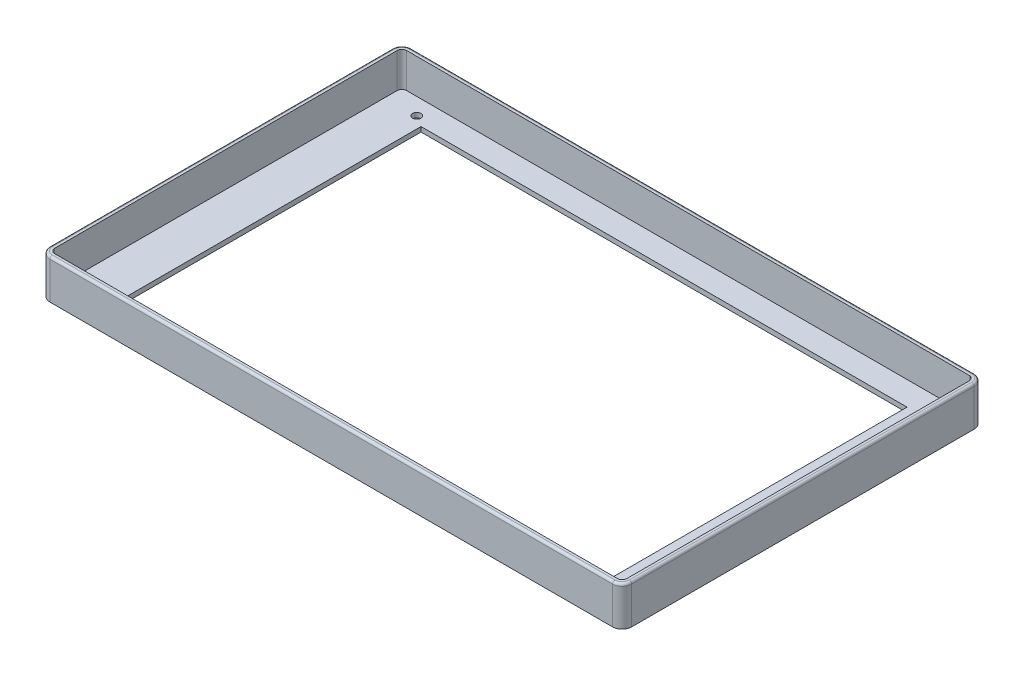
ISO-10303-21;
HEADER;
FILE_DESCRIPTION(('STEP AP214'),'2;1');
FILE_NAME('part.step','',(''),(''),'','','');
FILE_SCHEMA(('AUTOMOTIVE_DESIGN { 1 0 10303 214 1 1 1 1 }'));
ENDSEC;
DATA;
#1=APPLICATION_CONTEXT('core data for automotive mechanical design processes');
#2=APPLICATION_PROTOCOL_DEFINITION('international standard','automotive_design',2000,#1);
#3=PRODUCT_CONTEXT('',#1,'mechanical');
#4=PRODUCT('Part','Part','',(#3));
#5=PRODUCT_RELATED_PRODUCT_CATEGORY('part','',(#4));
#6=PRODUCT_DEFINITION_FORMATION('','',#4);
#7=PRODUCT_DEFINITION_CONTEXT('part definition',#1,'design');
#8=PRODUCT_DEFINITION('design','',#6,#7);
#9=PRODUCT_DEFINITION_SHAPE('','',#8);
#10=(LENGTH_UNIT() NAMED_UNIT(*) SI_UNIT(.MILLI.,.METRE.));
#11=(NAMED_UNIT(*) PLANE_ANGLE_UNIT() SI_UNIT($,.RADIAN.));
#12=(NAMED_UNIT(*) SI_UNIT($,.STERADIAN.) SOLID_ANGLE_UNIT());
#13=UNCERTAINTY_MEASURE_WITH_UNIT(LENGTH_MEASURE(1.E-05),#10,'distance_accuracy_value','');
#14=(GEOMETRIC_REPRESENTATION_CONTEXT(3) GLOBAL_UNCERTAINTY_ASSIGNED_CONTEXT((#13)) GLOBAL_UNIT_ASSIGNED_CONTEXT((#10,
#11,#12)) REPRESENTATION_CONTEXT('',''));
#15=CARTESIAN_POINT('',(0.,0.,0.));
#16=DIRECTION('',(0.,0.,1.));
#17=DIRECTION('',(1.,0.,0.));
#18=AXIS2_PLACEMENT_3D('',#15,#16,#17);
#19=CARTESIAN_POINT('',(0.,2.,0.));
#20=DIRECTION('',(0.,-1.,0.));
#21=DIRECTION('',(0.,0.,-1.));
#22=AXIS2_PLACEMENT_3D('',#19,#20,#21);
#23=PLANE('',#22);
#24=CARTESIAN_POINT('',(233.33,2.,-142.));
#25=DIRECTION('',(0.,1.,0.));
#26=DIRECTION('',(0.,0.,1.));
#27=AXIS2_PLACEMENT_3D('',#24,#25,#26);
#28=CIRCLE('',#27,1.75000000000001);
#29=CARTESIAN_POINT('',(233.33,2.,-140.25));
#30=VERTEX_POINT('',#29);
#31=EDGE_CURVE('E383',#30,#30,#28,.T.);
#32=ORIENTED_EDGE('',*,*,#31,.F.);
#33=EDGE_LOOP('',(#32));
#34=FACE_BOUND('',#33,.T.);
#35=CARTESIAN_POINT('',(15.23,2.,-9.));
#36=DIRECTION('',(0.,1.,0.));
#37=DIRECTION('',(0.,0.,1.));
#38=AXIS2_PLACEMENT_3D('',#35,#36,#37);
#39=CIRCLE('',#38,1.75);
#40=CARTESIAN_POINT('',(15.23,2.,-7.25));
#41=VERTEX_POINT('',#40);
#42=EDGE_CURVE('E393',#41,#41,#39,.T.);
#43=ORIENTED_EDGE('',*,*,#42,.F.);
#44=EDGE_LOOP('',(#43));
#45=FACE_BOUND('',#44,.T.);
#46=CARTESIAN_POINT('',(233.33,2.,-9.));
#47=DIRECTION('',(0.,1.,0.));
#48=DIRECTION('',(0.,0.,1.));
#49=AXIS2_PLACEMENT_3D('',#46,#47,#48);
#50=CIRCLE('',#49,1.75000000000001);
#51=CARTESIAN_POINT('',(233.33,2.,-7.24999999999999));
#52=VERTEX_POINT('',#51);
#53=EDGE_CURVE('E376',#52,#52,#50,.T.);
#54=ORIENTED_EDGE('',*,*,#53,.F.);
#55=EDGE_LOOP('',(#54));
#56=FACE_BOUND('',#55,.T.);
#57=CARTESIAN_POINT('',(15.23,2.,-142.));
#58=DIRECTION('',(0.,1.,0.));
#59=DIRECTION('',(0.,0.,1.));
#60=AXIS2_PLACEMENT_3D('',#57,#58,#59);
#61=CIRCLE('',#60,1.75);
#62=CARTESIAN_POINT('',(15.23,2.,-140.25));
#63=VERTEX_POINT('',#62);
#64=EDGE_CURVE('E390',#63,#63,#61,.T.);
#65=ORIENTED_EDGE('',*,*,#64,.F.);
#66=EDGE_LOOP('',(#65));
#67=FACE_BOUND('',#66,.T.);
#68=DIRECTION('',(0.,0.,1.));
#69=VECTOR('',#68,1.);
#70=CARTESIAN_POINT('',(2.,2.,-2.));
#71=LINE('',#70,#69);
#72=CARTESIAN_POINT('',(2.,2.,-147.));
#73=VERTEX_POINT('',#72);
#74=CARTESIAN_POINT('',(2.,2.,-4.));
#75=VERTEX_POINT('',#74);
#76=EDGE_CURVE('E398',#73,#75,#71,.T.);
#77=ORIENTED_EDGE('',*,*,#76,.T.);
#78=CARTESIAN_POINT('',(4.,2.,-4.));
#79=DIRECTION('',(0.,-1.,0.));
#80=DIRECTION('',(0.,0.,-1.));
#81=AXIS2_PLACEMENT_3D('',#78,#79,#80);
#82=CIRCLE('',#81,2.);
#83=CARTESIAN_POINT('',(4.,2.,-2.));
#84=VERTEX_POINT('',#83);
#85=EDGE_CURVE('E268',#75,#84,#82,.F.);
#86=ORIENTED_EDGE('',*,*,#85,.T.);
#87=DIRECTION('',(1.,0.,0.));
#88=VECTOR('',#87,1.);
#89=CARTESIAN_POINT('',(2.,2.,-2.));
#90=LINE('',#89,#88);
#91=CARTESIAN_POINT('',(239.,2.,-2.));
#92=VERTEX_POINT('',#91);
#93=EDGE_CURVE('E418',#84,#92,#90,.T.);
#94=ORIENTED_EDGE('',*,*,#93,.T.);
#95=CARTESIAN_POINT('',(239.,2.,-4.));
#96=DIRECTION('',(0.,-1.,0.));
#97=DIRECTION('',(0.,0.,-1.));
#98=AXIS2_PLACEMENT_3D('',#95,#96,#97);
#99=CIRCLE('',#98,2.);
#100=CARTESIAN_POINT('',(241.,2.,-4.));
#101=VERTEX_POINT('',#100);
#102=EDGE_CURVE('E266',#92,#101,#99,.F.);
#103=ORIENTED_EDGE('',*,*,#102,.T.);
#104=DIRECTION('',(0.,0.,-1.));
#105=VECTOR('',#104,1.);
#106=CARTESIAN_POINT('',(241.,2.,-2.));
#107=LINE('',#106,#105);
#108=CARTESIAN_POINT('',(241.,2.,-147.));
#109=VERTEX_POINT('',#108);
#110=EDGE_CURVE('E420',#101,#109,#107,.T.);
#111=ORIENTED_EDGE('',*,*,#110,.T.);
#112=CARTESIAN_POINT('',(239.,2.,-147.));
#113=DIRECTION('',(0.,-1.,0.));
#114=DIRECTION('',(0.,0.,-1.));
#115=AXIS2_PLACEMENT_3D('',#112,#113,#114);
#116=CIRCLE('',#115,2.);
#117=CARTESIAN_POINT('',(239.,2.,-149.));
#118=VERTEX_POINT('',#117);
#119=EDGE_CURVE('E262',#109,#118,#116,.F.);
#120=ORIENTED_EDGE('',*,*,#119,.T.);
#121=DIRECTION('',(-1.,0.,0.));
#122=VECTOR('',#121,1.);
#123=CARTESIAN_POINT('',(2.,2.,-149.));
#124=LINE('',#123,#122);
#125=CARTESIAN_POINT('',(4.,2.,-149.));
#126=VERTEX_POINT('',#125);
#127=EDGE_CURVE('E408',#118,#126,#124,.T.);
#128=ORIENTED_EDGE('',*,*,#127,.T.);
#129=CARTESIAN_POINT('',(4.,2.,-147.));
#130=DIRECTION('',(0.,-1.,0.));
#131=DIRECTION('',(0.,0.,-1.));
#132=AXIS2_PLACEMENT_3D('',#129,#130,#131);
#133=CIRCLE('',#132,2.);
#134=EDGE_CURVE('E265',#126,#73,#133,.F.);
#135=ORIENTED_EDGE('',*,*,#134,.T.);
#136=EDGE_LOOP('',(#77,#86,#94,#103,#111,#120,#128,#135));
#137=FACE_BOUND('',#136,.T.);
#138=DIRECTION('',(0.,0.,1.));
#139=VECTOR('',#138,1.);
#140=CARTESIAN_POINT('',(20.,2.,-14.));
#141=LINE('',#140,#139);
#142=CARTESIAN_POINT('',(20.,2.,-139.));
#143=VERTEX_POINT('',#142);
#144=CARTESIAN_POINT('',(20.,2.,-14.));
#145=VERTEX_POINT('',#144);
#146=EDGE_CURVE('E201',#143,#145,#141,.T.);
#147=ORIENTED_EDGE('',*,*,#146,.F.);
#148=DIRECTION('',(-1.,0.,0.));
#149=VECTOR('',#148,1.);
#150=CARTESIAN_POINT('',(20.,2.,-139.));
#151=LINE('',#150,#149);
#152=CARTESIAN_POINT('',(223.,2.,-139.));
#153=VERTEX_POINT('',#152);
#154=EDGE_CURVE('E227',#153,#143,#151,.T.);
#155=ORIENTED_EDGE('',*,*,#154,.F.);
#156=DIRECTION('',(0.,0.,-1.));
#157=VECTOR('',#156,1.);
#158=CARTESIAN_POINT('',(223.,2.,-14.));
#159=LINE('',#158,#157);
#160=CARTESIAN_POINT('',(223.,2.,-14.));
#161=VERTEX_POINT('',#160);
#162=EDGE_CURVE('E228',#161,#153,#159,.T.);
#163=ORIENTED_EDGE('',*,*,#162,.F.);
#164=DIRECTION('',(1.,0.,0.));
#165=VECTOR('',#164,1.);
#166=CARTESIAN_POINT('',(20.,2.,-14.));
#167=LINE('',#166,#165);
#168=EDGE_CURVE('E213',#145,#161,#167,.T.);
#169=ORIENTED_EDGE('',*,*,#168,.F.);
#170=EDGE_LOOP('',(#147,#155,#163,#169));
#171=FACE_BOUND('',#170,.T.);
#172=ADVANCED_FACE('F39',(#34,#45,#56,#67,#137,#171),#23,.F.);
#173=CARTESIAN_POINT('',(0.,0.,0.));
#174=DIRECTION('',(0.,-1.,0.));
#175=DIRECTION('',(0.,0.,-1.));
#176=AXIS2_PLACEMENT_3D('',#173,#174,#175);
#177=PLANE('',#176);
#178=CARTESIAN_POINT('',(233.33,0.,-142.));
#179=DIRECTION('',(0.,1.,0.));
#180=DIRECTION('',(0.,0.,1.));
#181=AXIS2_PLACEMENT_3D('',#178,#179,#180);
#182=CIRCLE('',#181,1.75000000000001);
#183=CARTESIAN_POINT('',(233.33,0.,-140.25));
#184=VERTEX_POINT('',#183);
#185=EDGE_CURVE('E389',#184,#184,#182,.T.);
#186=ORIENTED_EDGE('',*,*,#185,.T.);
#187=EDGE_LOOP('',(#186));
#188=FACE_BOUND('',#187,.T.);
#189=CARTESIAN_POINT('',(15.23,0.,-9.));
#190=DIRECTION('',(0.,1.,0.));
#191=DIRECTION('',(0.,0.,1.));
#192=AXIS2_PLACEMENT_3D('',#189,#190,#191);
#193=CIRCLE('',#192,1.75);
#194=CARTESIAN_POINT('',(15.23,0.,-7.25));
#195=VERTEX_POINT('',#194);
#196=EDGE_CURVE('E381',#195,#195,#193,.T.);
#197=ORIENTED_EDGE('',*,*,#196,.T.);
#198=EDGE_LOOP('',(#197));
#199=FACE_BOUND('',#198,.T.);
#200=CARTESIAN_POINT('',(233.33,0.,-9.));
#201=DIRECTION('',(0.,1.,0.));
#202=DIRECTION('',(0.,0.,1.));
#203=AXIS2_PLACEMENT_3D('',#200,#201,#202);
#204=CIRCLE('',#203,1.75000000000001);
#205=CARTESIAN_POINT('',(233.33,0.,-7.24999999999999));
#206=VERTEX_POINT('',#205);
#207=EDGE_CURVE('E367',#206,#206,#204,.T.);
#208=ORIENTED_EDGE('',*,*,#207,.T.);
#209=EDGE_LOOP('',(#208));
#210=FACE_BOUND('',#209,.T.);
#211=CARTESIAN_POINT('',(15.23,0.,-142.));
#212=DIRECTION('',(0.,1.,0.));
#213=DIRECTION('',(0.,0.,1.));
#214=AXIS2_PLACEMENT_3D('',#211,#212,#213);
#215=CIRCLE('',#214,1.75);
#216=CARTESIAN_POINT('',(15.23,0.,-140.25));
#217=VERTEX_POINT('',#216);
#218=EDGE_CURVE('E399',#217,#217,#215,.T.);
#219=ORIENTED_EDGE('',*,*,#218,.T.);
#220=EDGE_LOOP('',(#219));
#221=FACE_BOUND('',#220,.T.);
#222=DIRECTION('',(0.,0.,1.));
#223=VECTOR('',#222,1.);
#224=CARTESIAN_POINT('',(0.,0.,0.));
#225=LINE('',#224,#223);
#226=CARTESIAN_POINT('',(0.,0.,-147.));
#227=VERTEX_POINT('',#226);
#228=CARTESIAN_POINT('',(0.,0.,-4.));
#229=VERTEX_POINT('',#228);
#230=EDGE_CURVE('E222',#227,#229,#225,.T.);
#231=ORIENTED_EDGE('',*,*,#230,.F.);
#232=CARTESIAN_POINT('',(4.,0.,-147.));
#233=DIRECTION('',(0.,-1.,0.));
#234=DIRECTION('',(0.,0.,-1.));
#235=AXIS2_PLACEMENT_3D('',#232,#233,#234);
#236=CIRCLE('',#235,4.);
#237=CARTESIAN_POINT('',(4.,0.,-151.));
#238=VERTEX_POINT('',#237);
#239=EDGE_CURVE('E303',#227,#238,#236,.T.);
#240=ORIENTED_EDGE('',*,*,#239,.T.);
#241=DIRECTION('',(-1.,0.,0.));
#242=VECTOR('',#241,1.);
#243=CARTESIAN_POINT('',(0.,0.,-151.));
#244=LINE('',#243,#242);
#245=CARTESIAN_POINT('',(239.,0.,-151.));
#246=VERTEX_POINT('',#245);
#247=EDGE_CURVE('E255',#246,#238,#244,.T.);
#248=ORIENTED_EDGE('',*,*,#247,.F.);
#249=CARTESIAN_POINT('',(239.,0.,-147.));
#250=DIRECTION('',(0.,-1.,0.));
#251=DIRECTION('',(0.,0.,-1.));
#252=AXIS2_PLACEMENT_3D('',#249,#250,#251);
#253=CIRCLE('',#252,4.);
#254=CARTESIAN_POINT('',(243.,0.,-147.));
#255=VERTEX_POINT('',#254);
#256=EDGE_CURVE('E301',#246,#255,#253,.T.);
#257=ORIENTED_EDGE('',*,*,#256,.T.);
#258=DIRECTION('',(0.,0.,-1.));
#259=VECTOR('',#258,1.);
#260=CARTESIAN_POINT('',(243.,0.,0.));
#261=LINE('',#260,#259);
#262=CARTESIAN_POINT('',(243.,0.,-4.));
#263=VERTEX_POINT('',#262);
#264=EDGE_CURVE('E253',#263,#255,#261,.T.);
#265=ORIENTED_EDGE('',*,*,#264,.F.);
#266=CARTESIAN_POINT('',(239.,0.,-4.));
#267=DIRECTION('',(0.,-1.,0.));
#268=DIRECTION('',(0.,0.,-1.));
#269=AXIS2_PLACEMENT_3D('',#266,#267,#268);
#270=CIRCLE('',#269,4.);
#271=CARTESIAN_POINT('',(239.,0.,0.));
#272=VERTEX_POINT('',#271);
#273=EDGE_CURVE('E296',#263,#272,#270,.T.);
#274=ORIENTED_EDGE('',*,*,#273,.T.);
#275=DIRECTION('',(1.,0.,0.));
#276=VECTOR('',#275,1.);
#277=CARTESIAN_POINT('',(0.,0.,0.));
#278=LINE('',#277,#276);
#279=CARTESIAN_POINT('',(4.,0.,0.));
#280=VERTEX_POINT('',#279);
#281=EDGE_CURVE('E250',#280,#272,#278,.T.);
#282=ORIENTED_EDGE('',*,*,#281,.F.);
#283=CARTESIAN_POINT('',(4.,0.,-4.));
#284=DIRECTION('',(0.,-1.,0.));
#285=DIRECTION('',(0.,0.,-1.));
#286=AXIS2_PLACEMENT_3D('',#283,#284,#285);
#287=CIRCLE('',#286,4.);
#288=EDGE_CURVE('E297',#280,#229,#287,.T.);
#289=ORIENTED_EDGE('',*,*,#288,.T.);
#290=EDGE_LOOP('',(#231,#240,#248,#257,#265,#274,#282,#289));
#291=FACE_BOUND('',#290,.T.);
#292=DIRECTION('',(-1.,0.,0.));
#293=VECTOR('',#292,1.);
#294=CARTESIAN_POINT('',(20.,0.,-139.));
#295=LINE('',#294,#293);
#296=CARTESIAN_POINT('',(223.,0.,-139.));
#297=VERTEX_POINT('',#296);
#298=CARTESIAN_POINT('',(20.,0.,-139.));
#299=VERTEX_POINT('',#298);
#300=EDGE_CURVE('E212',#297,#299,#295,.T.);
#301=ORIENTED_EDGE('',*,*,#300,.T.);
#302=DIRECTION('',(0.,0.,1.));
#303=VECTOR('',#302,1.);
#304=CARTESIAN_POINT('',(20.,0.,-14.));
#305=LINE('',#304,#303);
#306=CARTESIAN_POINT('',(20.,0.,-14.));
#307=VERTEX_POINT('',#306);
#308=EDGE_CURVE('E235',#299,#307,#305,.T.);
#309=ORIENTED_EDGE('',*,*,#308,.T.);
#310=DIRECTION('',(1.,0.,0.));
#311=VECTOR('',#310,1.);
#312=CARTESIAN_POINT('',(20.,0.,-14.));
#313=LINE('',#312,#311);
#314=CARTESIAN_POINT('',(223.,0.,-14.));
#315=VERTEX_POINT('',#314);
#316=EDGE_CURVE('E219',#307,#315,#313,.T.);
#317=ORIENTED_EDGE('',*,*,#316,.T.);
#318=DIRECTION('',(0.,0.,-1.));
#319=VECTOR('',#318,1.);
#320=CARTESIAN_POINT('',(223.,0.,-14.));
#321=LINE('',#320,#319);
#322=EDGE_CURVE('E240',#315,#297,#321,.T.);
#323=ORIENTED_EDGE('',*,*,#322,.T.);
#324=EDGE_LOOP('',(#301,#309,#317,#323));
#325=FACE_BOUND('',#324,.T.);
#326=ADVANCED_FACE('F475',(#188,#199,#210,#221,#291,#325),#177,.T.);
#327=CARTESIAN_POINT('',(0.,2.,0.));
#328=DIRECTION('',(1.,0.,0.));
#329=DIRECTION('',(0.,0.,-1.));
#330=AXIS2_PLACEMENT_3D('',#327,#328,#329);
#331=PLANE('',#330);
#332=DIRECTION('',(0.,-1.,0.));
#333=VECTOR('',#332,1.);
#334=CARTESIAN_POINT('',(0.,2.,-4.));
#335=LINE('',#334,#333);
#336=CARTESIAN_POINT('',(0.,15.5,-4.));
#337=VERTEX_POINT('',#336);
#338=EDGE_CURVE('E291',#229,#337,#335,.F.);
#339=ORIENTED_EDGE('',*,*,#338,.T.);
#340=DIRECTION('',(0.,0.,1.));
#341=VECTOR('',#340,1.);
#342=CARTESIAN_POINT('',(0.,15.5,0.));
#343=LINE('',#342,#341);
#344=CARTESIAN_POINT('',(0.,15.5,-147.));
#345=VERTEX_POINT('',#344);
#346=EDGE_CURVE('E340',#337,#345,#343,.F.);
#347=ORIENTED_EDGE('',*,*,#346,.T.);
#348=DIRECTION('',(0.,-1.,0.));
#349=VECTOR('',#348,1.);
#350=CARTESIAN_POINT('',(0.,2.,-147.));
#351=LINE('',#350,#349);
#352=EDGE_CURVE('E298',#345,#227,#351,.T.);
#353=ORIENTED_EDGE('',*,*,#352,.T.);
#354=ORIENTED_EDGE('',*,*,#230,.T.);
#355=EDGE_LOOP('',(#339,#347,#353,#354));
#356=FACE_BOUND('',#355,.T.);
#357=ADVANCED_FACE('F481',(#356),#331,.F.);
#358=CARTESIAN_POINT('',(0.,2.,0.));
#359=DIRECTION('',(0.,0.,-1.));
#360=DIRECTION('',(-1.,0.,0.));
#361=AXIS2_PLACEMENT_3D('',#358,#359,#360);
#362=PLANE('',#361);
#363=DIRECTION('',(0.,-1.,0.));
#364=VECTOR('',#363,1.);
#365=CARTESIAN_POINT('',(239.,2.,0.));
#366=LINE('',#365,#364);
#367=CARTESIAN_POINT('',(239.,15.5,0.));
#368=VERTEX_POINT('',#367);
#369=EDGE_CURVE('E320',#272,#368,#366,.F.);
#370=ORIENTED_EDGE('',*,*,#369,.T.);
#371=DIRECTION('',(1.,0.,0.));
#372=VECTOR('',#371,1.);
#373=CARTESIAN_POINT('',(0.,15.5,0.));
#374=LINE('',#373,#372);
#375=CARTESIAN_POINT('',(4.,15.5,0.));
#376=VERTEX_POINT('',#375);
#377=EDGE_CURVE('E11',#368,#376,#374,.F.);
#378=ORIENTED_EDGE('',*,*,#377,.T.);
#379=DIRECTION('',(0.,-1.,0.));
#380=VECTOR('',#379,1.);
#381=CARTESIAN_POINT('',(4.,2.,0.));
#382=LINE('',#381,#380);
#383=EDGE_CURVE('E312',#376,#280,#382,.T.);
#384=ORIENTED_EDGE('',*,*,#383,.T.);
#385=ORIENTED_EDGE('',*,*,#281,.T.);
#386=EDGE_LOOP('',(#370,#378,#384,#385));
#387=FACE_BOUND('',#386,.T.);
#388=ADVANCED_FACE('F497',(#387),#362,.F.);
#389=CARTESIAN_POINT('',(243.,2.,0.));
#390=DIRECTION('',(-1.,0.,0.));
#391=DIRECTION('',(0.,0.,1.));
#392=AXIS2_PLACEMENT_3D('',#389,#390,#391);
#393=PLANE('',#392);
#394=DIRECTION('',(0.,-1.,0.));
#395=VECTOR('',#394,1.);
#396=CARTESIAN_POINT('',(243.,2.,-147.));
#397=LINE('',#396,#395);
#398=CARTESIAN_POINT('',(243.,15.5,-147.));
#399=VERTEX_POINT('',#398);
#400=EDGE_CURVE('E311',#255,#399,#397,.F.);
#401=ORIENTED_EDGE('',*,*,#400,.T.);
#402=DIRECTION('',(0.,0.,-1.));
#403=VECTOR('',#402,1.);
#404=CARTESIAN_POINT('',(243.,15.5,0.));
#405=LINE('',#404,#403);
#406=CARTESIAN_POINT('',(243.,15.5,-4.));
#407=VERTEX_POINT('',#406);
#408=EDGE_CURVE('E62',#399,#407,#405,.F.);
#409=ORIENTED_EDGE('',*,*,#408,.T.);
#410=DIRECTION('',(0.,-1.,0.));
#411=VECTOR('',#410,1.);
#412=CARTESIAN_POINT('',(243.,2.,-4.));
#413=LINE('',#412,#411);
#414=EDGE_CURVE('E313',#407,#263,#413,.T.);
#415=ORIENTED_EDGE('',*,*,#414,.T.);
#416=ORIENTED_EDGE('',*,*,#264,.T.);
#417=EDGE_LOOP('',(#401,#409,#415,#416));
#418=FACE_BOUND('',#417,.T.);
#419=ADVANCED_FACE('F495',(#418),#393,.F.);
#420=CARTESIAN_POINT('',(0.,2.,-151.));
#421=DIRECTION('',(0.,0.,1.));
#422=DIRECTION('',(1.,0.,0.));
#423=AXIS2_PLACEMENT_3D('',#420,#421,#422);
#424=PLANE('',#423);
#425=DIRECTION('',(0.,-1.,0.));
#426=VECTOR('',#425,1.);
#427=CARTESIAN_POINT('',(4.,2.,-151.));
#428=LINE('',#427,#426);
#429=CARTESIAN_POINT('',(4.,15.5,-151.));
#430=VERTEX_POINT('',#429);
#431=EDGE_CURVE('E306',#238,#430,#428,.F.);
#432=ORIENTED_EDGE('',*,*,#431,.T.);
#433=DIRECTION('',(-1.,0.,0.));
#434=VECTOR('',#433,1.);
#435=CARTESIAN_POINT('',(0.,15.5,-151.));
#436=LINE('',#435,#434);
#437=CARTESIAN_POINT('',(239.,15.5,-151.));
#438=VERTEX_POINT('',#437);
#439=EDGE_CURVE('E345',#430,#438,#436,.F.);
#440=ORIENTED_EDGE('',*,*,#439,.T.);
#441=DIRECTION('',(0.,-1.,0.));
#442=VECTOR('',#441,1.);
#443=CARTESIAN_POINT('',(239.,2.,-151.));
#444=LINE('',#443,#442);
#445=EDGE_CURVE('E308',#438,#246,#444,.T.);
#446=ORIENTED_EDGE('',*,*,#445,.T.);
#447=ORIENTED_EDGE('',*,*,#247,.T.);
#448=EDGE_LOOP('',(#432,#440,#446,#447));
#449=FACE_BOUND('',#448,.T.);
#450=ADVANCED_FACE('F487',(#449),#424,.F.);
#451=CARTESIAN_POINT('',(20.,2.,-14.));
#452=DIRECTION('',(1.,0.,0.));
#453=DIRECTION('',(0.,0.,-1.));
#454=AXIS2_PLACEMENT_3D('',#451,#452,#453);
#455=PLANE('',#454);
#456=ORIENTED_EDGE('',*,*,#308,.F.);
#457=DIRECTION('',(0.,-1.,0.));
#458=VECTOR('',#457,1.);
#459=CARTESIAN_POINT('',(20.,2.,-139.));
#460=LINE('',#459,#458);
#461=EDGE_CURVE('E207',#143,#299,#460,.T.);
#462=ORIENTED_EDGE('',*,*,#461,.F.);
#463=ORIENTED_EDGE('',*,*,#146,.T.);
#464=DIRECTION('',(0.,-1.,0.));
#465=VECTOR('',#464,1.);
#466=CARTESIAN_POINT('',(20.,2.,-14.));
#467=LINE('',#466,#465);
#468=EDGE_CURVE('E206',#145,#307,#467,.T.);
#469=ORIENTED_EDGE('',*,*,#468,.T.);
#470=EDGE_LOOP('',(#456,#462,#463,#469));
#471=FACE_BOUND('',#470,.T.);
#472=ADVANCED_FACE('F202',(#471),#455,.T.);
#473=CARTESIAN_POINT('',(20.,2.,-14.));
#474=DIRECTION('',(0.,0.,-1.));
#475=DIRECTION('',(-1.,0.,0.));
#476=AXIS2_PLACEMENT_3D('',#473,#474,#475);
#477=PLANE('',#476);
#478=ORIENTED_EDGE('',*,*,#316,.F.);
#479=ORIENTED_EDGE('',*,*,#468,.F.);
#480=ORIENTED_EDGE('',*,*,#168,.T.);
#481=DIRECTION('',(0.,-1.,0.));
#482=VECTOR('',#481,1.);
#483=CARTESIAN_POINT('',(223.,2.,-14.));
#484=LINE('',#483,#482);
#485=EDGE_CURVE('E225',#161,#315,#484,.T.);
#486=ORIENTED_EDGE('',*,*,#485,.T.);
#487=EDGE_LOOP('',(#478,#479,#480,#486));
#488=FACE_BOUND('',#487,.T.);
#489=ADVANCED_FACE('F220',(#488),#477,.T.);
#490=CARTESIAN_POINT('',(223.,2.,-14.));
#491=DIRECTION('',(-1.,0.,0.));
#492=DIRECTION('',(0.,0.,1.));
#493=AXIS2_PLACEMENT_3D('',#490,#491,#492);
#494=PLANE('',#493);
#495=ORIENTED_EDGE('',*,*,#322,.F.);
#496=ORIENTED_EDGE('',*,*,#485,.F.);
#497=ORIENTED_EDGE('',*,*,#162,.T.);
#498=DIRECTION('',(0.,-1.,0.));
#499=VECTOR('',#498,1.);
#500=CARTESIAN_POINT('',(223.,2.,-139.));
#501=LINE('',#500,#499);
#502=EDGE_CURVE('E242',#153,#297,#501,.T.);
#503=ORIENTED_EDGE('',*,*,#502,.T.);
#504=EDGE_LOOP('',(#495,#496,#497,#503));
#505=FACE_BOUND('',#504,.T.);
#506=ADVANCED_FACE('F672',(#505),#494,.T.);
#507=CARTESIAN_POINT('',(20.,2.,-139.));
#508=DIRECTION('',(0.,0.,1.));
#509=DIRECTION('',(1.,0.,0.));
#510=AXIS2_PLACEMENT_3D('',#507,#508,#509);
#511=PLANE('',#510);
#512=ORIENTED_EDGE('',*,*,#300,.F.);
#513=ORIENTED_EDGE('',*,*,#502,.F.);
#514=ORIENTED_EDGE('',*,*,#154,.T.);
#515=ORIENTED_EDGE('',*,*,#461,.T.);
#516=EDGE_LOOP('',(#512,#513,#514,#515));
#517=FACE_BOUND('',#516,.T.);
#518=ADVANCED_FACE('F670',(#517),#511,.T.);
#519=CARTESIAN_POINT('',(0.,16.5,0.));
#520=DIRECTION('',(0.,-1.,0.));
#521=DIRECTION('',(0.,0.,-1.));
#522=AXIS2_PLACEMENT_3D('',#519,#520,#521);
#523=PLANE('',#522);
#524=DIRECTION('',(0.,0.,1.));
#525=VECTOR('',#524,1.);
#526=CARTESIAN_POINT('',(1.,16.5,0.));
#527=LINE('',#526,#525);
#528=CARTESIAN_POINT('',(1.,16.5,-147.));
#529=VERTEX_POINT('',#528);
#530=CARTESIAN_POINT('',(1.,16.5,-4.));
#531=VERTEX_POINT('',#530);
#532=EDGE_CURVE('E332',#529,#531,#527,.T.);
#533=ORIENTED_EDGE('',*,*,#532,.T.);
#534=CARTESIAN_POINT('',(4.,16.5,-4.));
#535=DIRECTION('',(0.,-1.,0.));
#536=DIRECTION('',(0.,0.,-1.));
#537=AXIS2_PLACEMENT_3D('',#534,#535,#536);
#538=CIRCLE('',#537,3.);
#539=CARTESIAN_POINT('',(4.,16.5,-1.));
#540=VERTEX_POINT('',#539);
#541=EDGE_CURVE('E334',#531,#540,#538,.F.);
#542=ORIENTED_EDGE('',*,*,#541,.T.);
#543=DIRECTION('',(1.,0.,0.));
#544=VECTOR('',#543,1.);
#545=CARTESIAN_POINT('',(0.,16.5,-1.));
#546=LINE('',#545,#544);
#547=CARTESIAN_POINT('',(239.,16.5,-1.));
#548=VERTEX_POINT('',#547);
#549=EDGE_CURVE('E317',#540,#548,#546,.T.);
#550=ORIENTED_EDGE('',*,*,#549,.T.);
#551=CARTESIAN_POINT('',(239.,16.5,-4.));
#552=DIRECTION('',(0.,-1.,0.));
#553=DIRECTION('',(0.,0.,-1.));
#554=AXIS2_PLACEMENT_3D('',#551,#552,#553);
#555=CIRCLE('',#554,3.);
#556=CARTESIAN_POINT('',(242.,16.5,-4.));
#557=VERTEX_POINT('',#556);
#558=EDGE_CURVE('E321',#548,#557,#555,.F.);
#559=ORIENTED_EDGE('',*,*,#558,.T.);
#560=DIRECTION('',(0.,0.,-1.));
#561=VECTOR('',#560,1.);
#562=CARTESIAN_POINT('',(242.,16.5,0.));
#563=LINE('',#562,#561);
#564=CARTESIAN_POINT('',(242.,16.5,-147.));
#565=VERTEX_POINT('',#564);
#566=EDGE_CURVE('E323',#557,#565,#563,.T.);
#567=ORIENTED_EDGE('',*,*,#566,.T.);
#568=CARTESIAN_POINT('',(239.,16.5,-147.));
#569=DIRECTION('',(0.,-1.,0.));
#570=DIRECTION('',(0.,0.,-1.));
#571=AXIS2_PLACEMENT_3D('',#568,#569,#570);
#572=CIRCLE('',#571,3.);
#573=CARTESIAN_POINT('',(239.,16.5,-150.));
#574=VERTEX_POINT('',#573);
#575=EDGE_CURVE('E324',#565,#574,#572,.F.);
#576=ORIENTED_EDGE('',*,*,#575,.T.);
#577=DIRECTION('',(-1.,0.,0.));
#578=VECTOR('',#577,1.);
#579=CARTESIAN_POINT('',(0.,16.5,-150.));
#580=LINE('',#579,#578);
#581=CARTESIAN_POINT('',(4.,16.5,-150.));
#582=VERTEX_POINT('',#581);
#583=EDGE_CURVE('E330',#574,#582,#580,.T.);
#584=ORIENTED_EDGE('',*,*,#583,.T.);
#585=CARTESIAN_POINT('',(4.,16.5,-147.));
#586=DIRECTION('',(0.,-1.,0.));
#587=DIRECTION('',(0.,0.,-1.));
#588=AXIS2_PLACEMENT_3D('',#585,#586,#587);
#589=CIRCLE('',#588,3.);
#590=EDGE_CURVE('E328',#582,#529,#589,.F.);
#591=ORIENTED_EDGE('',*,*,#590,.T.);
#592=EDGE_LOOP('',(#533,#542,#550,#559,#567,#576,#584,#591));
#593=FACE_BOUND('',#592,.T.);
#594=DIRECTION('',(0.,0.,1.));
#595=VECTOR('',#594,1.);
#596=CARTESIAN_POINT('',(2.,16.5,-2.));
#597=LINE('',#596,#595);
#598=CARTESIAN_POINT('',(2.,16.5,-147.));
#599=VERTEX_POINT('',#598);
#600=CARTESIAN_POINT('',(2.,16.5,-4.));
#601=VERTEX_POINT('',#600);
#602=EDGE_CURVE('E405',#599,#601,#597,.T.);
#603=ORIENTED_EDGE('',*,*,#602,.F.);
#604=CARTESIAN_POINT('',(4.,16.5,-147.));
#605=DIRECTION('',(0.,-1.,0.));
#606=DIRECTION('',(0.,0.,-1.));
#607=AXIS2_PLACEMENT_3D('',#604,#605,#606);
#608=CIRCLE('',#607,2.);
#609=CARTESIAN_POINT('',(4.,16.5,-149.));
#610=VERTEX_POINT('',#609);
#611=EDGE_CURVE('E292',#599,#610,#608,.T.);
#612=ORIENTED_EDGE('',*,*,#611,.T.);
#613=DIRECTION('',(-1.,0.,0.));
#614=VECTOR('',#613,1.);
#615=CARTESIAN_POINT('',(2.,16.5,-149.));
#616=LINE('',#615,#614);
#617=CARTESIAN_POINT('',(239.,16.5,-149.));
#618=VERTEX_POINT('',#617);
#619=EDGE_CURVE('E232',#618,#610,#616,.T.);
#620=ORIENTED_EDGE('',*,*,#619,.F.);
#621=CARTESIAN_POINT('',(239.,16.5,-147.));
#622=DIRECTION('',(0.,-1.,0.));
#623=DIRECTION('',(0.,0.,-1.));
#624=AXIS2_PLACEMENT_3D('',#621,#622,#623);
#625=CIRCLE('',#624,2.);
#626=CARTESIAN_POINT('',(241.,16.5,-147.));
#627=VERTEX_POINT('',#626);
#628=EDGE_CURVE('E288',#618,#627,#625,.T.);
#629=ORIENTED_EDGE('',*,*,#628,.T.);
#630=DIRECTION('',(0.,0.,-1.));
#631=VECTOR('',#630,1.);
#632=CARTESIAN_POINT('',(241.,16.5,-2.));
#633=LINE('',#632,#631);
#634=CARTESIAN_POINT('',(241.,16.5,-4.));
#635=VERTEX_POINT('',#634);
#636=EDGE_CURVE('E410',#635,#627,#633,.T.);
#637=ORIENTED_EDGE('',*,*,#636,.F.);
#638=CARTESIAN_POINT('',(239.,16.5,-4.));
#639=DIRECTION('',(0.,-1.,0.));
#640=DIRECTION('',(0.,0.,-1.));
#641=AXIS2_PLACEMENT_3D('',#638,#639,#640);
#642=CIRCLE('',#641,2.);
#643=CARTESIAN_POINT('',(239.,16.5,-2.));
#644=VERTEX_POINT('',#643);
#645=EDGE_CURVE('E286',#635,#644,#642,.T.);
#646=ORIENTED_EDGE('',*,*,#645,.T.);
#647=DIRECTION('',(1.,0.,0.));
#648=VECTOR('',#647,1.);
#649=CARTESIAN_POINT('',(2.,16.5,-2.));
#650=LINE('',#649,#648);
#651=CARTESIAN_POINT('',(4.,16.5,-2.));
#652=VERTEX_POINT('',#651);
#653=EDGE_CURVE('E403',#652,#644,#650,.T.);
#654=ORIENTED_EDGE('',*,*,#653,.F.);
#655=CARTESIAN_POINT('',(4.,16.5,-4.));
#656=DIRECTION('',(0.,-1.,0.));
#657=DIRECTION('',(0.,0.,-1.));
#658=AXIS2_PLACEMENT_3D('',#655,#656,#657);
#659=CIRCLE('',#658,2.);
#660=EDGE_CURVE('E281',#652,#601,#659,.T.);
#661=ORIENTED_EDGE('',*,*,#660,.T.);
#662=EDGE_LOOP('',(#603,#612,#620,#629,#637,#646,#654,#661));
#663=FACE_BOUND('',#662,.T.);
#664=ADVANCED_FACE('F440',(#593,#663),#523,.F.);
#665=CARTESIAN_POINT('',(2.,16.5,-2.));
#666=DIRECTION('',(1.,0.,0.));
#667=DIRECTION('',(0.,0.,-1.));
#668=AXIS2_PLACEMENT_3D('',#665,#666,#667);
#669=PLANE('',#668);
#670=ORIENTED_EDGE('',*,*,#602,.T.);
#671=DIRECTION('',(0.,-1.,0.));
#672=VECTOR('',#671,1.);
#673=CARTESIAN_POINT('',(2.,2.,-4.));
#674=LINE('',#673,#672);
#675=EDGE_CURVE('E259',#601,#75,#674,.T.);
#676=ORIENTED_EDGE('',*,*,#675,.T.);
#677=ORIENTED_EDGE('',*,*,#76,.F.);
#678=DIRECTION('',(0.,-1.,0.));
#679=VECTOR('',#678,1.);
#680=CARTESIAN_POINT('',(2.,16.5,-147.));
#681=LINE('',#680,#679);
#682=EDGE_CURVE('E260',#73,#599,#681,.F.);
#683=ORIENTED_EDGE('',*,*,#682,.T.);
#684=EDGE_LOOP('',(#670,#676,#677,#683));
#685=FACE_BOUND('',#684,.T.);
#686=ADVANCED_FACE('F460',(#685),#669,.T.);
#687=CARTESIAN_POINT('',(2.,16.5,-2.));
#688=DIRECTION('',(0.,0.,-1.));
#689=DIRECTION('',(-1.,0.,0.));
#690=AXIS2_PLACEMENT_3D('',#687,#688,#689);
#691=PLANE('',#690);
#692=ORIENTED_EDGE('',*,*,#93,.F.);
#693=DIRECTION('',(0.,-1.,0.));
#694=VECTOR('',#693,1.);
#695=CARTESIAN_POINT('',(4.,16.5,-2.));
#696=LINE('',#695,#694);
#697=EDGE_CURVE('E272',#84,#652,#696,.F.);
#698=ORIENTED_EDGE('',*,*,#697,.T.);
#699=ORIENTED_EDGE('',*,*,#653,.T.);
#700=DIRECTION('',(0.,-1.,0.));
#701=VECTOR('',#700,1.);
#702=CARTESIAN_POINT('',(239.,2.,-2.));
#703=LINE('',#702,#701);
#704=EDGE_CURVE('E269',#644,#92,#703,.T.);
#705=ORIENTED_EDGE('',*,*,#704,.T.);
#706=EDGE_LOOP('',(#692,#698,#699,#705));
#707=FACE_BOUND('',#706,.T.);
#708=ADVANCED_FACE('F446',(#707),#691,.T.);
#709=CARTESIAN_POINT('',(241.,16.5,-2.));
#710=DIRECTION('',(-1.,0.,0.));
#711=DIRECTION('',(0.,0.,1.));
#712=AXIS2_PLACEMENT_3D('',#709,#710,#711);
#713=PLANE('',#712);
#714=ORIENTED_EDGE('',*,*,#110,.F.);
#715=DIRECTION('',(0.,-1.,0.));
#716=VECTOR('',#715,1.);
#717=CARTESIAN_POINT('',(241.,16.5,-4.));
#718=LINE('',#717,#716);
#719=EDGE_CURVE('E279',#101,#635,#718,.F.);
#720=ORIENTED_EDGE('',*,*,#719,.T.);
#721=ORIENTED_EDGE('',*,*,#636,.T.);
#722=DIRECTION('',(0.,-1.,0.));
#723=VECTOR('',#722,1.);
#724=CARTESIAN_POINT('',(241.,2.,-147.));
#725=LINE('',#724,#723);
#726=EDGE_CURVE('E274',#627,#109,#725,.T.);
#727=ORIENTED_EDGE('',*,*,#726,.T.);
#728=EDGE_LOOP('',(#714,#720,#721,#727));
#729=FACE_BOUND('',#728,.T.);
#730=ADVANCED_FACE('F442',(#729),#713,.T.);
#731=CARTESIAN_POINT('',(2.,16.5,-149.));
#732=DIRECTION('',(0.,0.,1.));
#733=DIRECTION('',(1.,0.,0.));
#734=AXIS2_PLACEMENT_3D('',#731,#732,#733);
#735=PLANE('',#734);
#736=ORIENTED_EDGE('',*,*,#127,.F.);
#737=DIRECTION('',(0.,-1.,0.));
#738=VECTOR('',#737,1.);
#739=CARTESIAN_POINT('',(239.,16.5,-149.));
#740=LINE('',#739,#738);
#741=EDGE_CURVE('E282',#118,#618,#740,.F.);
#742=ORIENTED_EDGE('',*,*,#741,.T.);
#743=ORIENTED_EDGE('',*,*,#619,.T.);
#744=DIRECTION('',(0.,-1.,0.));
#745=VECTOR('',#744,1.);
#746=CARTESIAN_POINT('',(4.,2.,-149.));
#747=LINE('',#746,#745);
#748=EDGE_CURVE('E278',#610,#126,#747,.T.);
#749=ORIENTED_EDGE('',*,*,#748,.T.);
#750=EDGE_LOOP('',(#736,#742,#743,#749));
#751=FACE_BOUND('',#750,.T.);
#752=ADVANCED_FACE('F430',(#751),#735,.T.);
#753=CARTESIAN_POINT('',(15.23,0.,-142.));
#754=DIRECTION('',(0.,1.,0.));
#755=DIRECTION('',(0.,0.,1.));
#756=AXIS2_PLACEMENT_3D('',#753,#754,#755);
#757=CYLINDRICAL_SURFACE('',#756,1.75);
#758=ORIENTED_EDGE('',*,*,#218,.F.);
#759=EDGE_LOOP('',(#758));
#760=FACE_BOUND('',#759,.T.);
#761=ORIENTED_EDGE('',*,*,#64,.T.);
#762=EDGE_LOOP('',(#761));
#763=FACE_BOUND('',#762,.T.);
#764=ADVANCED_FACE('F775',(#760,#763),#757,.F.);
#765=CARTESIAN_POINT('',(233.33,0.,-9.));
#766=DIRECTION('',(0.,1.,0.));
#767=DIRECTION('',(0.,0.,1.));
#768=AXIS2_PLACEMENT_3D('',#765,#766,#767);
#769=CYLINDRICAL_SURFACE('',#768,1.75000000000001);
#770=ORIENTED_EDGE('',*,*,#207,.F.);
#771=EDGE_LOOP('',(#770));
#772=FACE_BOUND('',#771,.T.);
#773=ORIENTED_EDGE('',*,*,#53,.T.);
#774=EDGE_LOOP('',(#773));
#775=FACE_BOUND('',#774,.T.);
#776=ADVANCED_FACE('F776',(#772,#775),#769,.F.);
#777=CARTESIAN_POINT('',(15.23,0.,-9.));
#778=DIRECTION('',(0.,1.,0.));
#779=DIRECTION('',(0.,0.,1.));
#780=AXIS2_PLACEMENT_3D('',#777,#778,#779);
#781=CYLINDRICAL_SURFACE('',#780,1.75);
#782=ORIENTED_EDGE('',*,*,#196,.F.);
#783=EDGE_LOOP('',(#782));
#784=FACE_BOUND('',#783,.T.);
#785=ORIENTED_EDGE('',*,*,#42,.T.);
#786=EDGE_LOOP('',(#785));
#787=FACE_BOUND('',#786,.T.);
#788=ADVANCED_FACE('F788',(#784,#787),#781,.F.);
#789=CARTESIAN_POINT('',(233.33,0.,-142.));
#790=DIRECTION('',(0.,1.,0.));
#791=DIRECTION('',(0.,0.,1.));
#792=AXIS2_PLACEMENT_3D('',#789,#790,#791);
#793=CYLINDRICAL_SURFACE('',#792,1.75000000000001);
#794=ORIENTED_EDGE('',*,*,#185,.F.);
#795=EDGE_LOOP('',(#794));
#796=FACE_BOUND('',#795,.T.);
#797=ORIENTED_EDGE('',*,*,#31,.T.);
#798=EDGE_LOOP('',(#797));
#799=FACE_BOUND('',#798,.T.);
#800=ADVANCED_FACE('F501',(#796,#799),#793,.F.);
#801=CARTESIAN_POINT('',(4.,16.5,-4.));
#802=DIRECTION('',(0.,1.,0.));
#803=DIRECTION('',(0.,0.,1.));
#804=AXIS2_PLACEMENT_3D('',#801,#802,#803);
#805=CYLINDRICAL_SURFACE('',#804,2.);
#806=ORIENTED_EDGE('',*,*,#660,.F.);
#807=ORIENTED_EDGE('',*,*,#697,.F.);
#808=ORIENTED_EDGE('',*,*,#85,.F.);
#809=ORIENTED_EDGE('',*,*,#675,.F.);
#810=EDGE_LOOP('',(#806,#807,#808,#809));
#811=FACE_BOUND('',#810,.T.);
#812=ADVANCED_FACE('F455',(#811),#805,.F.);
#813=CARTESIAN_POINT('',(239.,16.5,-4.));
#814=DIRECTION('',(0.,1.,0.));
#815=DIRECTION('',(0.,0.,1.));
#816=AXIS2_PLACEMENT_3D('',#813,#814,#815);
#817=CYLINDRICAL_SURFACE('',#816,2.);
#818=ORIENTED_EDGE('',*,*,#645,.F.);
#819=ORIENTED_EDGE('',*,*,#719,.F.);
#820=ORIENTED_EDGE('',*,*,#102,.F.);
#821=ORIENTED_EDGE('',*,*,#704,.F.);
#822=EDGE_LOOP('',(#818,#819,#820,#821));
#823=FACE_BOUND('',#822,.T.);
#824=ADVANCED_FACE('F441',(#823),#817,.F.);
#825=CARTESIAN_POINT('',(239.,16.5,-147.));
#826=DIRECTION('',(0.,1.,0.));
#827=DIRECTION('',(0.,0.,1.));
#828=AXIS2_PLACEMENT_3D('',#825,#826,#827);
#829=CYLINDRICAL_SURFACE('',#828,2.);
#830=ORIENTED_EDGE('',*,*,#628,.F.);
#831=ORIENTED_EDGE('',*,*,#741,.F.);
#832=ORIENTED_EDGE('',*,*,#119,.F.);
#833=ORIENTED_EDGE('',*,*,#726,.F.);
#834=EDGE_LOOP('',(#830,#831,#832,#833));
#835=FACE_BOUND('',#834,.T.);
#836=ADVANCED_FACE('F435',(#835),#829,.F.);
#837=CARTESIAN_POINT('',(4.,16.5,-147.));
#838=DIRECTION('',(0.,1.,0.));
#839=DIRECTION('',(0.,0.,1.));
#840=AXIS2_PLACEMENT_3D('',#837,#838,#839);
#841=CYLINDRICAL_SURFACE('',#840,2.);
#842=ORIENTED_EDGE('',*,*,#611,.F.);
#843=ORIENTED_EDGE('',*,*,#682,.F.);
#844=ORIENTED_EDGE('',*,*,#134,.F.);
#845=ORIENTED_EDGE('',*,*,#748,.F.);
#846=EDGE_LOOP('',(#842,#843,#844,#845));
#847=FACE_BOUND('',#846,.T.);
#848=ADVANCED_FACE('F458',(#847),#841,.F.);
#849=CARTESIAN_POINT('',(4.,2.,-147.));
#850=DIRECTION('',(0.,-1.,0.));
#851=DIRECTION('',(0.,0.,-1.));
#852=AXIS2_PLACEMENT_3D('',#849,#850,#851);
#853=CYLINDRICAL_SURFACE('',#852,4.);
#854=ORIENTED_EDGE('',*,*,#352,.F.);
#855=CARTESIAN_POINT('',(4.,15.5,-147.));
#856=DIRECTION('',(0.,-1.,0.));
#857=DIRECTION('',(0.,0.,-1.));
#858=AXIS2_PLACEMENT_3D('',#855,#856,#857);
#859=CIRCLE('',#858,4.);
#860=EDGE_CURVE('E344',#345,#430,#859,.T.);
#861=ORIENTED_EDGE('',*,*,#860,.T.);
#862=ORIENTED_EDGE('',*,*,#431,.F.);
#863=ORIENTED_EDGE('',*,*,#239,.F.);
#864=EDGE_LOOP('',(#854,#861,#862,#863));
#865=FACE_BOUND('',#864,.T.);
#866=ADVANCED_FACE('F464',(#865),#853,.T.);
#867=CARTESIAN_POINT('',(239.,2.,-147.));
#868=DIRECTION('',(0.,-1.,0.));
#869=DIRECTION('',(0.,0.,-1.));
#870=AXIS2_PLACEMENT_3D('',#867,#868,#869);
#871=CYLINDRICAL_SURFACE('',#870,4.);
#872=ORIENTED_EDGE('',*,*,#445,.F.);
#873=CARTESIAN_POINT('',(239.,15.5,-147.));
#874=DIRECTION('',(0.,-1.,0.));
#875=DIRECTION('',(0.,0.,-1.));
#876=AXIS2_PLACEMENT_3D('',#873,#874,#875);
#877=CIRCLE('',#876,4.);
#878=EDGE_CURVE('E342',#438,#399,#877,.T.);
#879=ORIENTED_EDGE('',*,*,#878,.T.);
#880=ORIENTED_EDGE('',*,*,#400,.F.);
#881=ORIENTED_EDGE('',*,*,#256,.F.);
#882=EDGE_LOOP('',(#872,#879,#880,#881));
#883=FACE_BOUND('',#882,.T.);
#884=ADVANCED_FACE('F468',(#883),#871,.T.);
#885=CARTESIAN_POINT('',(239.,2.,-4.));
#886=DIRECTION('',(0.,-1.,0.));
#887=DIRECTION('',(0.,0.,-1.));
#888=AXIS2_PLACEMENT_3D('',#885,#886,#887);
#889=CYLINDRICAL_SURFACE('',#888,4.);
#890=ORIENTED_EDGE('',*,*,#414,.F.);
#891=CARTESIAN_POINT('',(239.,15.5,-4.));
#892=DIRECTION('',(0.,-1.,0.));
#893=DIRECTION('',(0.,0.,-1.));
#894=AXIS2_PLACEMENT_3D('',#891,#892,#893);
#895=CIRCLE('',#894,4.);
#896=EDGE_CURVE('E48',#407,#368,#895,.T.);
#897=ORIENTED_EDGE('',*,*,#896,.T.);
#898=ORIENTED_EDGE('',*,*,#369,.F.);
#899=ORIENTED_EDGE('',*,*,#273,.F.);
#900=EDGE_LOOP('',(#890,#897,#898,#899));
#901=FACE_BOUND('',#900,.T.);
#902=ADVANCED_FACE('F538',(#901),#889,.T.);
#903=CARTESIAN_POINT('',(4.,2.,-4.));
#904=DIRECTION('',(0.,-1.,0.));
#905=DIRECTION('',(0.,0.,-1.));
#906=AXIS2_PLACEMENT_3D('',#903,#904,#905);
#907=CYLINDRICAL_SURFACE('',#906,4.);
#908=ORIENTED_EDGE('',*,*,#383,.F.);
#909=CARTESIAN_POINT('',(4.,15.5,-4.));
#910=DIRECTION('',(0.,-1.,0.));
#911=DIRECTION('',(0.,0.,-1.));
#912=AXIS2_PLACEMENT_3D('',#909,#910,#911);
#913=CIRCLE('',#912,4.);
#914=EDGE_CURVE('E338',#376,#337,#913,.T.);
#915=ORIENTED_EDGE('',*,*,#914,.T.);
#916=ORIENTED_EDGE('',*,*,#338,.F.);
#917=ORIENTED_EDGE('',*,*,#288,.F.);
#918=EDGE_LOOP('',(#908,#915,#916,#917));
#919=FACE_BOUND('',#918,.T.);
#920=ADVANCED_FACE('F547',(#919),#907,.T.);
#921=CARTESIAN_POINT('',(239.,15.5,-147.));
#922=DIRECTION('',(0.,-1.,0.));
#923=DIRECTION('',(0.,0.,-1.));
#924=AXIS2_PLACEMENT_3D('',#921,#922,#923);
#925=TOROIDAL_SURFACE('',#924,3.,1.);
#926=CARTESIAN_POINT('',(242.,15.5,-147.));
#927=DIRECTION('',(0.,0.,1.));
#928=DIRECTION('',(1.,0.,0.));
#929=AXIS2_PLACEMENT_3D('',#926,#927,#928);
#930=CIRCLE('',#929,1.);
#931=EDGE_CURVE('E365',#399,#565,#930,.T.);
#932=ORIENTED_EDGE('',*,*,#931,.F.);
#933=ORIENTED_EDGE('',*,*,#878,.F.);
#934=CARTESIAN_POINT('',(239.,15.5,-150.));
#935=DIRECTION('',(-1.,0.,0.));
#936=DIRECTION('',(0.,0.,1.));
#937=AXIS2_PLACEMENT_3D('',#934,#935,#936);
#938=CIRCLE('',#937,1.);
#939=EDGE_CURVE('E43',#574,#438,#938,.T.);
#940=ORIENTED_EDGE('',*,*,#939,.F.);
#941=ORIENTED_EDGE('',*,*,#575,.F.);
#942=EDGE_LOOP('',(#932,#933,#940,#941));
#943=FACE_BOUND('',#942,.T.);
#944=ADVANCED_FACE('F41',(#943),#925,.T.);
#945=CARTESIAN_POINT('',(0.,15.5,-150.));
#946=DIRECTION('',(-1.,0.,0.));
#947=DIRECTION('',(0.,0.,1.));
#948=AXIS2_PLACEMENT_3D('',#945,#946,#947);
#949=CYLINDRICAL_SURFACE('',#948,1.);
#950=ORIENTED_EDGE('',*,*,#939,.T.);
#951=ORIENTED_EDGE('',*,*,#439,.F.);
#952=CARTESIAN_POINT('',(4.,15.5,-150.));
#953=DIRECTION('',(-1.,0.,0.));
#954=DIRECTION('',(0.,0.,1.));
#955=AXIS2_PLACEMENT_3D('',#952,#953,#954);
#956=CIRCLE('',#955,1.);
#957=EDGE_CURVE('E362',#582,#430,#956,.T.);
#958=ORIENTED_EDGE('',*,*,#957,.F.);
#959=ORIENTED_EDGE('',*,*,#583,.F.);
#960=EDGE_LOOP('',(#950,#951,#958,#959));
#961=FACE_BOUND('',#960,.T.);
#962=ADVANCED_FACE('F567',(#961),#949,.T.);
#963=CARTESIAN_POINT('',(242.,15.5,0.));
#964=DIRECTION('',(0.,0.,-1.));
#965=DIRECTION('',(-1.,0.,0.));
#966=AXIS2_PLACEMENT_3D('',#963,#964,#965);
#967=CYLINDRICAL_SURFACE('',#966,1.);
#968=ORIENTED_EDGE('',*,*,#931,.T.);
#969=ORIENTED_EDGE('',*,*,#566,.F.);
#970=CARTESIAN_POINT('',(242.,15.5,-4.));
#971=DIRECTION('',(0.,0.,1.));
#972=DIRECTION('',(1.,0.,0.));
#973=AXIS2_PLACEMENT_3D('',#970,#971,#972);
#974=CIRCLE('',#973,1.);
#975=EDGE_CURVE('E358',#407,#557,#974,.T.);
#976=ORIENTED_EDGE('',*,*,#975,.F.);
#977=ORIENTED_EDGE('',*,*,#408,.F.);
#978=EDGE_LOOP('',(#968,#969,#976,#977));
#979=FACE_BOUND('',#978,.T.);
#980=ADVANCED_FACE('F571',(#979),#967,.T.);
#981=CARTESIAN_POINT('',(4.,15.5,-147.));
#982=DIRECTION('',(0.,-1.,0.));
#983=DIRECTION('',(0.,0.,-1.));
#984=AXIS2_PLACEMENT_3D('',#981,#982,#983);
#985=TOROIDAL_SURFACE('',#984,3.,1.);
#986=ORIENTED_EDGE('',*,*,#957,.T.);
#987=ORIENTED_EDGE('',*,*,#860,.F.);
#988=CARTESIAN_POINT('',(1.,15.5,-147.));
#989=DIRECTION('',(0.,0.,1.));
#990=DIRECTION('',(1.,0.,0.));
#991=AXIS2_PLACEMENT_3D('',#988,#989,#990);
#992=CIRCLE('',#991,1.);
#993=EDGE_CURVE('E359',#529,#345,#992,.T.);
#994=ORIENTED_EDGE('',*,*,#993,.F.);
#995=ORIENTED_EDGE('',*,*,#590,.F.);
#996=EDGE_LOOP('',(#986,#987,#994,#995));
#997=FACE_BOUND('',#996,.T.);
#998=ADVANCED_FACE('F581',(#997),#985,.T.);
#999=CARTESIAN_POINT('',(239.,15.5,-4.));
#1000=DIRECTION('',(0.,-1.,0.));
#1001=DIRECTION('',(0.,0.,-1.));
#1002=AXIS2_PLACEMENT_3D('',#999,#1000,#1001);
#1003=TOROIDAL_SURFACE('',#1002,3.,1.);
#1004=ORIENTED_EDGE('',*,*,#975,.T.);
#1005=ORIENTED_EDGE('',*,*,#558,.F.);
#1006=CARTESIAN_POINT('',(239.,15.5,-1.));
#1007=DIRECTION('',(-1.,0.,0.));
#1008=DIRECTION('',(0.,0.,1.));
#1009=AXIS2_PLACEMENT_3D('',#1006,#1007,#1008);
#1010=CIRCLE('',#1009,1.);
#1011=EDGE_CURVE('E352',#368,#548,#1010,.T.);
#1012=ORIENTED_EDGE('',*,*,#1011,.F.);
#1013=ORIENTED_EDGE('',*,*,#896,.F.);
#1014=EDGE_LOOP('',(#1004,#1005,#1012,#1013));
#1015=FACE_BOUND('',#1014,.T.);
#1016=ADVANCED_FACE('F595',(#1015),#1003,.T.);
#1017=CARTESIAN_POINT('',(1.,15.5,0.));
#1018=DIRECTION('',(0.,0.,1.));
#1019=DIRECTION('',(1.,0.,0.));
#1020=AXIS2_PLACEMENT_3D('',#1017,#1018,#1019);
#1021=CYLINDRICAL_SURFACE('',#1020,1.);
#1022=ORIENTED_EDGE('',*,*,#993,.T.);
#1023=ORIENTED_EDGE('',*,*,#346,.F.);
#1024=CARTESIAN_POINT('',(1.,15.5,-4.));
#1025=DIRECTION('',(0.,0.,1.));
#1026=DIRECTION('',(1.,0.,0.));
#1027=AXIS2_PLACEMENT_3D('',#1024,#1025,#1026);
#1028=CIRCLE('',#1027,1.);
#1029=EDGE_CURVE('E353',#531,#337,#1028,.T.);
#1030=ORIENTED_EDGE('',*,*,#1029,.F.);
#1031=ORIENTED_EDGE('',*,*,#532,.F.);
#1032=EDGE_LOOP('',(#1022,#1023,#1030,#1031));
#1033=FACE_BOUND('',#1032,.T.);
#1034=ADVANCED_FACE('F605',(#1033),#1021,.T.);
#1035=CARTESIAN_POINT('',(0.,15.5,-1.));
#1036=DIRECTION('',(1.,0.,0.));
#1037=DIRECTION('',(0.,0.,-1.));
#1038=AXIS2_PLACEMENT_3D('',#1035,#1036,#1037);
#1039=CYLINDRICAL_SURFACE('',#1038,1.);
#1040=ORIENTED_EDGE('',*,*,#1011,.T.);
#1041=ORIENTED_EDGE('',*,*,#549,.F.);
#1042=CARTESIAN_POINT('',(4.,15.5,-1.));
#1043=DIRECTION('',(-1.,0.,0.));
#1044=DIRECTION('',(0.,0.,1.));
#1045=AXIS2_PLACEMENT_3D('',#1042,#1043,#1044);
#1046=CIRCLE('',#1045,1.);
#1047=EDGE_CURVE('E349',#376,#540,#1046,.T.);
#1048=ORIENTED_EDGE('',*,*,#1047,.F.);
#1049=ORIENTED_EDGE('',*,*,#377,.F.);
#1050=EDGE_LOOP('',(#1040,#1041,#1048,#1049));
#1051=FACE_BOUND('',#1050,.T.);
#1052=ADVANCED_FACE('F614',(#1051),#1039,.T.);
#1053=CARTESIAN_POINT('',(4.,15.5,-4.));
#1054=DIRECTION('',(0.,-1.,0.));
#1055=DIRECTION('',(0.,0.,-1.));
#1056=AXIS2_PLACEMENT_3D('',#1053,#1054,#1055);
#1057=TOROIDAL_SURFACE('',#1056,3.,1.);
#1058=ORIENTED_EDGE('',*,*,#1029,.T.);
#1059=ORIENTED_EDGE('',*,*,#914,.F.);
#1060=ORIENTED_EDGE('',*,*,#1047,.T.);
#1061=ORIENTED_EDGE('',*,*,#541,.F.);
#1062=EDGE_LOOP('',(#1058,#1059,#1060,#1061));
#1063=FACE_BOUND('',#1062,.T.);
#1064=ADVANCED_FACE('F625',(#1063),#1057,.T.);
#1065=CLOSED_SHELL('',(#172,#326,#357,#388,#419,#450,#472,#489,#506,#518,#664,#686,#708,#730,
#752,#764,#776,#788,#800,#812,#824,#836,#848,#866,#884,#902,#920,#944,#962,#980,#998,#1016,
#1034,#1052,#1064));
#1066=MANIFOLD_SOLID_BREP('B2',#1065);
#1067=ADVANCED_BREP_SHAPE_REPRESENTATION('',(#18,#1066),#14);
#1068=SHAPE_DEFINITION_REPRESENTATION(#9,#1067);
ENDSEC;
END-ISO-10303-21;
